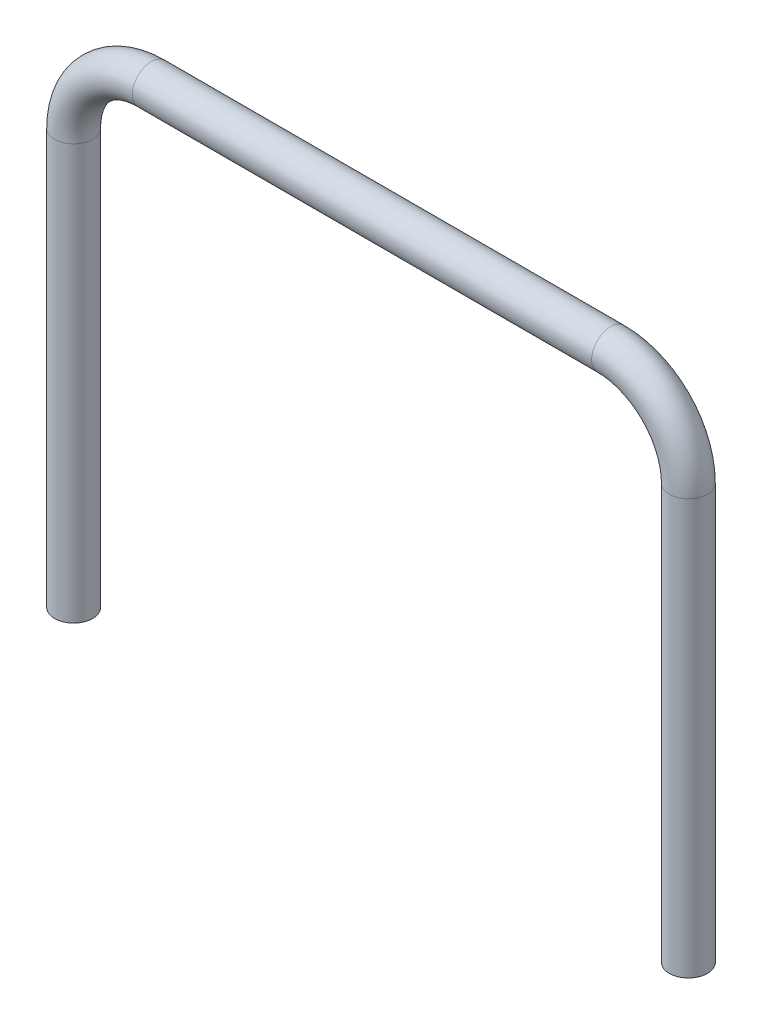
ISO-10303-21;
HEADER;
FILE_DESCRIPTION(('STEP AP214'),'2;1');
FILE_NAME('part.step','',(''),(''),'','','');
FILE_SCHEMA(('AUTOMOTIVE_DESIGN { 1 0 10303 214 1 1 1 1 }'));
ENDSEC;
DATA;
#1=APPLICATION_CONTEXT('core data for automotive mechanical design processes');
#2=APPLICATION_PROTOCOL_DEFINITION('international standard','automotive_design',2000,#1);
#3=PRODUCT_CONTEXT('',#1,'mechanical');
#4=PRODUCT('Part','Part','',(#3));
#5=PRODUCT_RELATED_PRODUCT_CATEGORY('part','',(#4));
#6=PRODUCT_DEFINITION_FORMATION('','',#4);
#7=PRODUCT_DEFINITION_CONTEXT('part definition',#1,'design');
#8=PRODUCT_DEFINITION('design','',#6,#7);
#9=PRODUCT_DEFINITION_SHAPE('','',#8);
#10=(LENGTH_UNIT() NAMED_UNIT(*) SI_UNIT(.MILLI.,.METRE.));
#11=(NAMED_UNIT(*) PLANE_ANGLE_UNIT() SI_UNIT($,.RADIAN.));
#12=(NAMED_UNIT(*) SI_UNIT($,.STERADIAN.) SOLID_ANGLE_UNIT());
#13=UNCERTAINTY_MEASURE_WITH_UNIT(LENGTH_MEASURE(1.E-05),#10,'distance_accuracy_value','');
#14=(GEOMETRIC_REPRESENTATION_CONTEXT(3) GLOBAL_UNCERTAINTY_ASSIGNED_CONTEXT((#13)) GLOBAL_UNIT_ASSIGNED_CONTEXT((#10,
#11,#12)) REPRESENTATION_CONTEXT('',''));
#15=CARTESIAN_POINT('',(0.,0.,0.));
#16=DIRECTION('',(0.,0.,1.));
#17=DIRECTION('',(1.,0.,0.));
#18=AXIS2_PLACEMENT_3D('',#15,#16,#17);
#19=CARTESIAN_POINT('',(-10.0457,-16.1036,0.));
#20=DIRECTION('',(0.,1.,0.));
#21=DIRECTION('',(0.,0.,1.));
#22=AXIS2_PLACEMENT_3D('',#19,#20,#21);
#23=PLANE('',#22);
#24=CARTESIAN_POINT('',(-10.0457,-16.1036,0.));
#25=DIRECTION('',(0.,1.,0.));
#26=DIRECTION('',(0.,0.,1.));
#27=AXIS2_PLACEMENT_3D('',#24,#25,#26);
#28=CIRCLE('',#27,0.622299999999999);
#29=CARTESIAN_POINT('',(-10.0457,-16.1036,0.622299999999999));
#30=VERTEX_POINT('',#29);
#31=EDGE_CURVE('E54',#30,#30,#28,.T.);
#32=ORIENTED_EDGE('',*,*,#31,.F.);
#33=EDGE_LOOP('',(#32));
#34=FACE_BOUND('',#33,.T.);
#35=ADVANCED_FACE('F32',(#34),#23,.F.);
#36=CARTESIAN_POINT('',(10.0457,-16.1036,0.));
#37=DIRECTION('',(0.,-1.,0.));
#38=DIRECTION('',(0.,0.,1.));
#39=AXIS2_PLACEMENT_3D('',#36,#37,#38);
#40=PLANE('',#39);
#41=CARTESIAN_POINT('',(10.0457,-16.1036,0.));
#42=DIRECTION('',(0.,-1.,0.));
#43=DIRECTION('',(0.,0.,1.));
#44=AXIS2_PLACEMENT_3D('',#41,#42,#43);
#45=CIRCLE('',#44,0.622299999999999);
#46=CARTESIAN_POINT('',(10.0457,-16.1036,0.622299999999999));
#47=VERTEX_POINT('',#46);
#48=EDGE_CURVE('E10',#47,#47,#45,.T.);
#49=ORIENTED_EDGE('',*,*,#48,.T.);
#50=EDGE_LOOP('',(#49));
#51=FACE_BOUND('',#50,.T.);
#52=ADVANCED_FACE('F61',(#51),#40,.T.);
#53=CARTESIAN_POINT('',(-10.0457,-16.1036,0.));
#54=DIRECTION('',(0.,1.,0.));
#55=DIRECTION('',(0.,0.,1.));
#56=AXIS2_PLACEMENT_3D('',#53,#54,#55);
#57=CYLINDRICAL_SURFACE('',#56,0.622299999999999);
#58=CARTESIAN_POINT('',(-10.0457,-2.54,0.));
#59=DIRECTION('',(0.,1.,0.));
#60=DIRECTION('',(0.,0.,1.));
#61=AXIS2_PLACEMENT_3D('',#58,#59,#60);
#62=CIRCLE('',#61,0.622299999999999);
#63=CARTESIAN_POINT('',(-10.668,-2.54,0.));
#64=VERTEX_POINT('',#63);
#65=EDGE_CURVE('E51',#64,#64,#62,.T.);
#66=ORIENTED_EDGE('',*,*,#65,.F.);
#67=EDGE_LOOP('',(#66));
#68=FACE_BOUND('',#67,.T.);
#69=ORIENTED_EDGE('',*,*,#31,.T.);
#70=EDGE_LOOP('',(#69));
#71=FACE_BOUND('',#70,.T.);
#72=ADVANCED_FACE('F58',(#68,#71),#57,.T.);
#73=CARTESIAN_POINT('',(-7.5057,-2.54,0.));
#74=DIRECTION('',(0.,0.,-1.));
#75=DIRECTION('',(-1.,0.,0.));
#76=AXIS2_PLACEMENT_3D('',#73,#74,#75);
#77=TOROIDAL_SURFACE('',#76,2.54,0.622299999999999);
#78=CARTESIAN_POINT('',(-7.5057,0.,0.));
#79=DIRECTION('',(1.,0.,0.));
#80=DIRECTION('',(0.,0.,1.));
#81=AXIS2_PLACEMENT_3D('',#78,#79,#80);
#82=CIRCLE('',#81,0.622299999999999);
#83=CARTESIAN_POINT('',(-7.5057,0.622299999999999,0.));
#84=VERTEX_POINT('',#83);
#85=EDGE_CURVE('E46',#84,#84,#82,.T.);
#86=CARTESIAN_POINT('',(-7.5057,-2.54,0.));
#87=DIRECTION('',(0.,0.,-1.));
#88=DIRECTION('',(-1.,0.,0.));
#89=AXIS2_PLACEMENT_3D('',#86,#87,#88);
#90=CIRCLE('',#89,3.1623);
#91=EDGE_CURVE('',#64,#84,#90,.T.);
#92=ORIENTED_EDGE('',*,*,#65,.T.);
#93=ORIENTED_EDGE('',*,*,#85,.F.);
#94=ORIENTED_EDGE('',*,*,#91,.T.);
#95=ORIENTED_EDGE('',*,*,#91,.F.);
#96=EDGE_LOOP('',(#92,#94,#93,#95));
#97=FACE_BOUND('',#96,.T.);
#98=ADVANCED_FACE('F79',(#97),#77,.T.);
#99=CARTESIAN_POINT('',(-7.5057,0.,0.));
#100=DIRECTION('',(1.,0.,0.));
#101=DIRECTION('',(0.,1.,0.));
#102=AXIS2_PLACEMENT_3D('',#99,#100,#101);
#103=CYLINDRICAL_SURFACE('',#102,0.622299999999999);
#104=CARTESIAN_POINT('',(7.5057,0.,0.));
#105=DIRECTION('',(1.,0.,0.));
#106=DIRECTION('',(0.,0.,1.));
#107=AXIS2_PLACEMENT_3D('',#104,#105,#106);
#108=CIRCLE('',#107,0.622299999999999);
#109=CARTESIAN_POINT('',(7.5057,0.622299999999999,0.));
#110=VERTEX_POINT('',#109);
#111=EDGE_CURVE('E42',#110,#110,#108,.T.);
#112=ORIENTED_EDGE('',*,*,#111,.F.);
#113=EDGE_LOOP('',(#112));
#114=FACE_BOUND('',#113,.T.);
#115=ORIENTED_EDGE('',*,*,#85,.T.);
#116=EDGE_LOOP('',(#115));
#117=FACE_BOUND('',#116,.T.);
#118=ADVANCED_FACE('F73',(#114,#117),#103,.T.);
#119=CARTESIAN_POINT('',(7.5057,-2.54,0.));
#120=DIRECTION('',(0.,0.,-1.));
#121=DIRECTION('',(-1.,0.,0.));
#122=AXIS2_PLACEMENT_3D('',#119,#120,#121);
#123=TOROIDAL_SURFACE('',#122,2.54,0.622299999999999);
#124=CARTESIAN_POINT('',(10.0457,-2.54,0.));
#125=DIRECTION('',(0.,-1.,0.));
#126=DIRECTION('',(0.,0.,1.));
#127=AXIS2_PLACEMENT_3D('',#124,#125,#126);
#128=CIRCLE('',#127,0.622299999999999);
#129=CARTESIAN_POINT('',(10.668,-2.54,0.));
#130=VERTEX_POINT('',#129);
#131=EDGE_CURVE('E38',#130,#130,#128,.T.);
#132=CARTESIAN_POINT('',(7.5057,-2.54,0.));
#133=DIRECTION('',(0.,0.,-1.));
#134=DIRECTION('',(-1.,0.,0.));
#135=AXIS2_PLACEMENT_3D('',#132,#133,#134);
#136=CIRCLE('',#135,3.1623);
#137=EDGE_CURVE('',#110,#130,#136,.T.);
#138=ORIENTED_EDGE('',*,*,#111,.T.);
#139=ORIENTED_EDGE('',*,*,#131,.F.);
#140=ORIENTED_EDGE('',*,*,#137,.T.);
#141=ORIENTED_EDGE('',*,*,#137,.F.);
#142=EDGE_LOOP('',(#138,#140,#139,#141));
#143=FACE_BOUND('',#142,.T.);
#144=ADVANCED_FACE('F67',(#143),#123,.T.);
#145=CARTESIAN_POINT('',(10.0457,-2.54,0.));
#146=DIRECTION('',(0.,-1.,0.));
#147=DIRECTION('',(0.,0.,-1.));
#148=AXIS2_PLACEMENT_3D('',#145,#146,#147);
#149=CYLINDRICAL_SURFACE('',#148,0.622299999999999);
#150=ORIENTED_EDGE('',*,*,#48,.F.);
#151=EDGE_LOOP('',(#150));
#152=FACE_BOUND('',#151,.T.);
#153=ORIENTED_EDGE('',*,*,#131,.T.);
#154=EDGE_LOOP('',(#153));
#155=FACE_BOUND('',#154,.T.);
#156=ADVANCED_FACE('F65',(#152,#155),#149,.T.);
#157=CLOSED_SHELL('',(#35,#52,#72,#98,#118,#144,#156));
#158=MANIFOLD_SOLID_BREP('B2',#157);
#159=ADVANCED_BREP_SHAPE_REPRESENTATION('',(#18,#158),#14);
#160=SHAPE_DEFINITION_REPRESENTATION(#9,#159);
ENDSEC;
END-ISO-10303-21;
